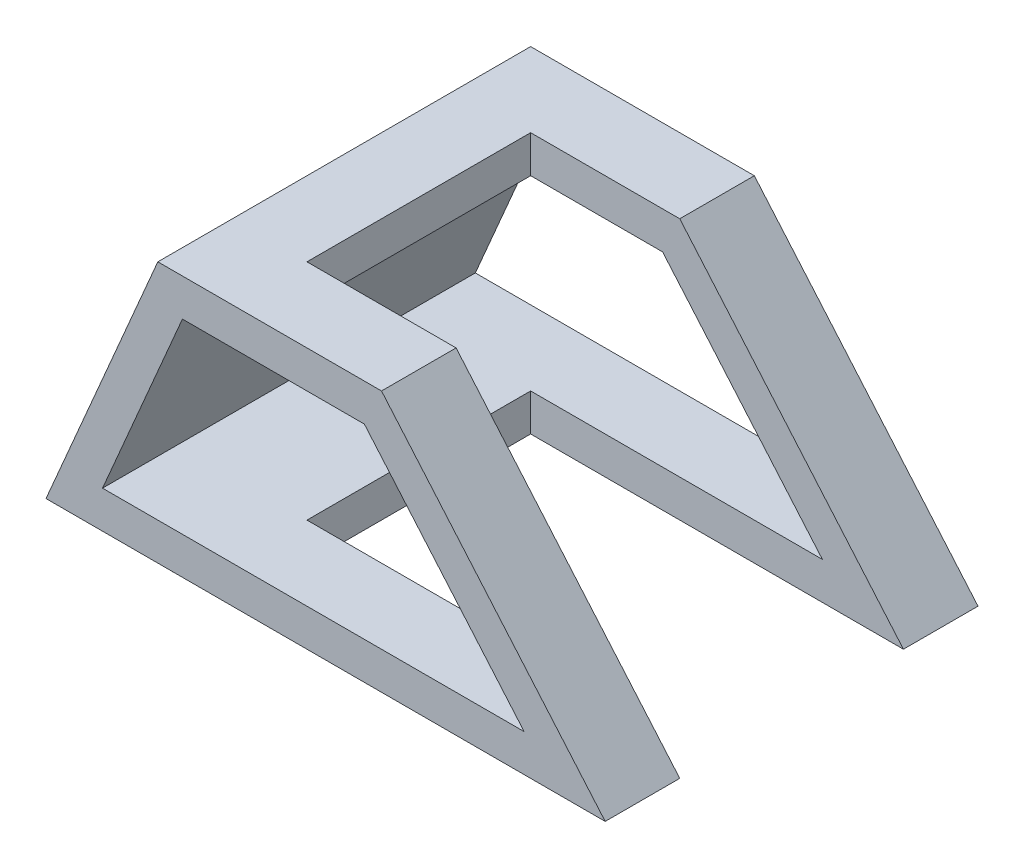
ISO-10303-21;
HEADER;
FILE_DESCRIPTION(('STEP AP214'),'2;1');
FILE_NAME('part.step','',(''),(''),'','','');
FILE_SCHEMA(('AUTOMOTIVE_DESIGN { 1 0 10303 214 1 1 1 1 }'));
ENDSEC;
DATA;
#1=APPLICATION_CONTEXT('core data for automotive mechanical design processes');
#2=APPLICATION_PROTOCOL_DEFINITION('international standard','automotive_design',2000,#1);
#3=PRODUCT_CONTEXT('',#1,'mechanical');
#4=PRODUCT('Part','Part','',(#3));
#5=PRODUCT_RELATED_PRODUCT_CATEGORY('part','',(#4));
#6=PRODUCT_DEFINITION_FORMATION('','',#4);
#7=PRODUCT_DEFINITION_CONTEXT('part definition',#1,'design');
#8=PRODUCT_DEFINITION('design','',#6,#7);
#9=PRODUCT_DEFINITION_SHAPE('','',#8);
#10=(LENGTH_UNIT() NAMED_UNIT(*) SI_UNIT(.MILLI.,.METRE.));
#11=(NAMED_UNIT(*) PLANE_ANGLE_UNIT() SI_UNIT($,.RADIAN.));
#12=(NAMED_UNIT(*) SI_UNIT($,.STERADIAN.) SOLID_ANGLE_UNIT());
#13=UNCERTAINTY_MEASURE_WITH_UNIT(LENGTH_MEASURE(1.E-05),#10,'distance_accuracy_value','');
#14=(GEOMETRIC_REPRESENTATION_CONTEXT(3) GLOBAL_UNCERTAINTY_ASSIGNED_CONTEXT((#13)) GLOBAL_UNIT_ASSIGNED_CONTEXT((#10,
#11,#12)) REPRESENTATION_CONTEXT('',''));
#15=CARTESIAN_POINT('',(0.,0.,0.));
#16=DIRECTION('',(0.,0.,1.));
#17=DIRECTION('',(1.,0.,0.));
#18=AXIS2_PLACEMENT_3D('',#15,#16,#17);
#19=CARTESIAN_POINT('',(60.,0.,100.));
#20=DIRECTION('',(-0.759256602365297,-0.650791373455968,0.));
#21=DIRECTION('',(0.650791373455968,-0.759256602365297,0.));
#22=AXIS2_PLACEMENT_3D('',#19,#20,#21);
#23=PLANE('',#22);
#24=DIRECTION('',(0.,0.,-1.));
#25=VECTOR('',#24,1.);
#26=CARTESIAN_POINT('',(120.,-70.,100.));
#27=LINE('',#26,#25);
#28=CARTESIAN_POINT('',(120.,-70.,100.));
#29=VERTEX_POINT('',#28);
#30=CARTESIAN_POINT('',(120.,-70.,80.));
#31=VERTEX_POINT('',#30);
#32=EDGE_CURVE('E185',#29,#31,#27,.T.);
#33=ORIENTED_EDGE('',*,*,#32,.T.);
#34=DIRECTION('',(0.650791373455969,-0.759256602365296,0.));
#35=VECTOR('',#34,1.);
#36=CARTESIAN_POINT('',(120.,-70.,80.));
#37=LINE('',#36,#35);
#38=CARTESIAN_POINT('',(60.,0.,80.));
#39=VERTEX_POINT('',#38);
#40=EDGE_CURVE('E170',#39,#31,#37,.T.);
#41=ORIENTED_EDGE('',*,*,#40,.F.);
#42=DIRECTION('',(0.,0.,-1.));
#43=VECTOR('',#42,1.);
#44=CARTESIAN_POINT('',(60.,0.,100.));
#45=LINE('',#44,#43);
#46=CARTESIAN_POINT('',(60.,0.,100.));
#47=VERTEX_POINT('',#46);
#48=EDGE_CURVE('E176',#47,#39,#45,.T.);
#49=ORIENTED_EDGE('',*,*,#48,.F.);
#50=DIRECTION('',(-0.650791373455968,0.759256602365297,0.));
#51=VECTOR('',#50,1.);
#52=CARTESIAN_POINT('',(60.,0.,100.));
#53=LINE('',#52,#51);
#54=EDGE_CURVE('E272',#29,#47,#53,.T.);
#55=ORIENTED_EDGE('',*,*,#54,.F.);
#56=EDGE_LOOP('',(#33,#41,#49,#55));
#57=FACE_BOUND('',#56,.T.);
#58=ADVANCED_FACE('F35',(#57),#23,.F.);
#59=CARTESIAN_POINT('',(55.4006507752959,-10.,0.));
#60=DIRECTION('',(0.759256602365297,0.650791373455969,0.));
#61=DIRECTION('',(-0.650791373455969,0.759256602365296,0.));
#62=AXIS2_PLACEMENT_3D('',#59,#60,#61);
#63=PLANE('',#62);
#64=DIRECTION('',(0.,0.,1.));
#65=VECTOR('',#64,1.);
#66=CARTESIAN_POINT('',(55.4006507752959,-10.,0.));
#67=LINE('',#66,#65);
#68=CARTESIAN_POINT('',(55.4006507752959,-10.,80.));
#69=VERTEX_POINT('',#68);
#70=CARTESIAN_POINT('',(55.4006507752959,-10.,100.));
#71=VERTEX_POINT('',#70);
#72=EDGE_CURVE('E262',#69,#71,#67,.T.);
#73=ORIENTED_EDGE('',*,*,#72,.F.);
#74=DIRECTION('',(0.650791373455969,-0.759256602365296,0.));
#75=VECTOR('',#74,1.);
#76=CARTESIAN_POINT('',(55.4006507752959,-10.,80.));
#77=LINE('',#76,#75);
#78=CARTESIAN_POINT('',(98.2577936324387,-60.,80.));
#79=VERTEX_POINT('',#78);
#80=EDGE_CURVE('E230',#69,#79,#77,.T.);
#81=ORIENTED_EDGE('',*,*,#80,.T.);
#82=DIRECTION('',(0.,0.,1.));
#83=VECTOR('',#82,1.);
#84=CARTESIAN_POINT('',(98.2577936324387,-60.,0.));
#85=LINE('',#84,#83);
#86=CARTESIAN_POINT('',(98.2577936324387,-60.,100.));
#87=VERTEX_POINT('',#86);
#88=EDGE_CURVE('E198',#79,#87,#85,.T.);
#89=ORIENTED_EDGE('',*,*,#88,.T.);
#90=DIRECTION('',(-0.650791373455969,0.759256602365297,0.));
#91=VECTOR('',#90,1.);
#92=CARTESIAN_POINT('',(55.4006507752959,-10.,100.));
#93=LINE('',#92,#91);
#94=EDGE_CURVE('E251',#87,#71,#93,.T.);
#95=ORIENTED_EDGE('',*,*,#94,.T.);
#96=EDGE_LOOP('',(#73,#81,#89,#95));
#97=FACE_BOUND('',#96,.T.);
#98=ADVANCED_FACE('F317',(#97),#63,.F.);
#99=CARTESIAN_POINT('',(-30.,-70.,100.));
#100=DIRECTION('',(0.919145030018058,-0.393919298579167,0.));
#101=DIRECTION('',(0.393919298579167,0.919145030018058,0.));
#102=AXIS2_PLACEMENT_3D('',#99,#100,#101);
#103=PLANE('',#102);
#104=DIRECTION('',(-0.393919298579167,-0.919145030018058,0.));
#105=VECTOR('',#104,1.);
#106=CARTESIAN_POINT('',(-30.,-70.,0.));
#107=LINE('',#106,#105);
#108=CARTESIAN_POINT('',(0.,0.,0.));
#109=VERTEX_POINT('',#108);
#110=CARTESIAN_POINT('',(-30.,-70.,0.));
#111=VERTEX_POINT('',#110);
#112=EDGE_CURVE('E258',#109,#111,#107,.T.);
#113=ORIENTED_EDGE('',*,*,#112,.T.);
#114=DIRECTION('',(0.,0.,-1.));
#115=VECTOR('',#114,1.);
#116=CARTESIAN_POINT('',(-30.,-70.,100.));
#117=LINE('',#116,#115);
#118=CARTESIAN_POINT('',(-30.,-70.,100.));
#119=VERTEX_POINT('',#118);
#120=EDGE_CURVE('E188',#119,#111,#117,.T.);
#121=ORIENTED_EDGE('',*,*,#120,.F.);
#122=DIRECTION('',(-0.393919298579167,-0.919145030018058,0.));
#123=VECTOR('',#122,1.);
#124=CARTESIAN_POINT('',(-30.,-70.,100.));
#125=LINE('',#124,#123);
#126=CARTESIAN_POINT('',(0.,0.,100.));
#127=VERTEX_POINT('',#126);
#128=EDGE_CURVE('E266',#127,#119,#125,.T.);
#129=ORIENTED_EDGE('',*,*,#128,.F.);
#130=DIRECTION('',(0.,0.,-1.));
#131=VECTOR('',#130,1.);
#132=CARTESIAN_POINT('',(0.,0.,100.));
#133=LINE('',#132,#131);
#134=EDGE_CURVE('E177',#127,#109,#133,.T.);
#135=ORIENTED_EDGE('',*,*,#134,.T.);
#136=EDGE_LOOP('',(#113,#121,#129,#135));
#137=FACE_BOUND('',#136,.T.);
#138=ADVANCED_FACE('F37',(#137),#103,.F.);
#139=CARTESIAN_POINT('',(120.,-70.,100.));
#140=DIRECTION('',(0.,1.,0.));
#141=DIRECTION('',(-1.,0.,0.));
#142=AXIS2_PLACEMENT_3D('',#139,#140,#141);
#143=PLANE('',#142);
#144=DIRECTION('',(0.,0.,1.));
#145=VECTOR('',#144,1.);
#146=CARTESIAN_POINT('',(20.,-70.,100.));
#147=LINE('',#146,#145);
#148=CARTESIAN_POINT('',(20.,-70.,20.));
#149=VERTEX_POINT('',#148);
#150=CARTESIAN_POINT('',(20.,-70.,80.));
#151=VERTEX_POINT('',#150);
#152=EDGE_CURVE('E216',#149,#151,#147,.T.);
#153=ORIENTED_EDGE('',*,*,#152,.T.);
#154=DIRECTION('',(1.,0.,0.));
#155=VECTOR('',#154,1.);
#156=CARTESIAN_POINT('',(120.,-70.,80.));
#157=LINE('',#156,#155);
#158=EDGE_CURVE('E211',#151,#31,#157,.T.);
#159=ORIENTED_EDGE('',*,*,#158,.T.);
#160=ORIENTED_EDGE('',*,*,#32,.F.);
#161=DIRECTION('',(1.,0.,0.));
#162=VECTOR('',#161,1.);
#163=CARTESIAN_POINT('',(120.,-70.,100.));
#164=LINE('',#163,#162);
#165=EDGE_CURVE('E269',#119,#29,#164,.T.);
#166=ORIENTED_EDGE('',*,*,#165,.F.);
#167=ORIENTED_EDGE('',*,*,#120,.T.);
#168=DIRECTION('',(1.,0.,0.));
#169=VECTOR('',#168,1.);
#170=CARTESIAN_POINT('',(120.,-70.,0.));
#171=LINE('',#170,#169);
#172=CARTESIAN_POINT('',(120.,-70.,0.));
#173=VERTEX_POINT('',#172);
#174=EDGE_CURVE('E277',#111,#173,#171,.T.);
#175=ORIENTED_EDGE('',*,*,#174,.T.);
#176=CARTESIAN_POINT('',(120.,-70.,20.));
#177=VERTEX_POINT('',#176);
#178=EDGE_CURVE('E179',#177,#173,#27,.T.);
#179=ORIENTED_EDGE('',*,*,#178,.F.);
#180=DIRECTION('',(-1.,0.,0.));
#181=VECTOR('',#180,1.);
#182=CARTESIAN_POINT('',(120.,-70.,20.));
#183=LINE('',#182,#181);
#184=EDGE_CURVE('E166',#177,#149,#183,.T.);
#185=ORIENTED_EDGE('',*,*,#184,.T.);
#186=EDGE_LOOP('',(#153,#159,#160,#166,#167,#175,#179,#185));
#187=FACE_BOUND('',#186,.T.);
#188=ADVANCED_FACE('F289',(#187),#143,.F.);
#189=CARTESIAN_POINT('',(60.,0.,20.));
#190=VERTEX_POINT('',#189);
#191=CARTESIAN_POINT('',(60.,0.,0.));
#192=VERTEX_POINT('',#191);
#193=EDGE_CURVE('E154',#190,#192,#45,.T.);
#194=ORIENTED_EDGE('',*,*,#193,.F.);
#195=DIRECTION('',(-0.650791373455969,0.759256602365296,0.));
#196=VECTOR('',#195,1.);
#197=CARTESIAN_POINT('',(60.,0.,20.));
#198=LINE('',#197,#196);
#199=EDGE_CURVE('E163',#177,#190,#198,.T.);
#200=ORIENTED_EDGE('',*,*,#199,.F.);
#201=ORIENTED_EDGE('',*,*,#178,.T.);
#202=DIRECTION('',(-0.650791373455968,0.759256602365297,0.));
#203=VECTOR('',#202,1.);
#204=CARTESIAN_POINT('',(60.,0.,0.));
#205=LINE('',#204,#203);
#206=EDGE_CURVE('E174',#173,#192,#205,.T.);
#207=ORIENTED_EDGE('',*,*,#206,.T.);
#208=EDGE_LOOP('',(#194,#200,#201,#207));
#209=FACE_BOUND('',#208,.T.);
#210=ADVANCED_FACE('F172',(#209),#23,.F.);
#211=CARTESIAN_POINT('',(0.,0.,100.));
#212=DIRECTION('',(0.,-1.,0.));
#213=DIRECTION('',(0.,0.,-1.));
#214=AXIS2_PLACEMENT_3D('',#211,#212,#213);
#215=PLANE('',#214);
#216=ORIENTED_EDGE('',*,*,#48,.T.);
#217=DIRECTION('',(1.,0.,0.));
#218=VECTOR('',#217,1.);
#219=CARTESIAN_POINT('',(60.,0.,80.));
#220=LINE('',#219,#218);
#221=CARTESIAN_POINT('',(20.,0.,80.));
#222=VERTEX_POINT('',#221);
#223=EDGE_CURVE('E220',#222,#39,#220,.T.);
#224=ORIENTED_EDGE('',*,*,#223,.F.);
#225=DIRECTION('',(0.,0.,1.));
#226=VECTOR('',#225,1.);
#227=CARTESIAN_POINT('',(20.,0.,80.));
#228=LINE('',#227,#226);
#229=CARTESIAN_POINT('',(20.,0.,20.));
#230=VERTEX_POINT('',#229);
#231=EDGE_CURVE('E158',#230,#222,#228,.T.);
#232=ORIENTED_EDGE('',*,*,#231,.F.);
#233=DIRECTION('',(-1.,0.,0.));
#234=VECTOR('',#233,1.);
#235=CARTESIAN_POINT('',(60.,0.,20.));
#236=LINE('',#235,#234);
#237=EDGE_CURVE('E149',#190,#230,#236,.T.);
#238=ORIENTED_EDGE('',*,*,#237,.F.);
#239=ORIENTED_EDGE('',*,*,#193,.T.);
#240=DIRECTION('',(-1.,0.,0.));
#241=VECTOR('',#240,1.);
#242=CARTESIAN_POINT('',(0.,0.,0.));
#243=LINE('',#242,#241);
#244=EDGE_CURVE('E270',#192,#109,#243,.T.);
#245=ORIENTED_EDGE('',*,*,#244,.T.);
#246=ORIENTED_EDGE('',*,*,#134,.F.);
#247=DIRECTION('',(-1.,0.,0.));
#248=VECTOR('',#247,1.);
#249=CARTESIAN_POINT('',(0.,0.,100.));
#250=LINE('',#249,#248);
#251=EDGE_CURVE('E181',#47,#127,#250,.T.);
#252=ORIENTED_EDGE('',*,*,#251,.F.);
#253=EDGE_LOOP('',(#216,#224,#232,#238,#239,#245,#246,#252));
#254=FACE_BOUND('',#253,.T.);
#255=ADVANCED_FACE('F152',(#254),#215,.F.);
#256=CARTESIAN_POINT('',(0.,0.,100.));
#257=DIRECTION('',(0.,0.,-1.));
#258=DIRECTION('',(-1.,0.,0.));
#259=AXIS2_PLACEMENT_3D('',#256,#257,#258);
#260=PLANE('',#259);
#261=DIRECTION('',(1.,0.,0.));
#262=VECTOR('',#261,1.);
#263=CARTESIAN_POINT('',(-14.8346098487658,-60.,100.));
#264=LINE('',#263,#262);
#265=CARTESIAN_POINT('',(-14.8346098487658,-60.,100.));
#266=VERTEX_POINT('',#265);
#267=EDGE_CURVE('E249',#266,#87,#264,.T.);
#268=ORIENTED_EDGE('',*,*,#267,.F.);
#269=DIRECTION('',(-0.393919298579167,-0.919145030018058,0.));
#270=VECTOR('',#269,1.);
#271=CARTESIAN_POINT('',(6.59396157980558,-10.,100.));
#272=LINE('',#271,#270);
#273=CARTESIAN_POINT('',(6.59396157980558,-10.,100.));
#274=VERTEX_POINT('',#273);
#275=EDGE_CURVE('E50',#274,#266,#272,.T.);
#276=ORIENTED_EDGE('',*,*,#275,.F.);
#277=DIRECTION('',(-1.,0.,0.));
#278=VECTOR('',#277,1.);
#279=CARTESIAN_POINT('',(55.4006507752959,-10.,100.));
#280=LINE('',#279,#278);
#281=EDGE_CURVE('E240',#71,#274,#280,.T.);
#282=ORIENTED_EDGE('',*,*,#281,.F.);
#283=ORIENTED_EDGE('',*,*,#94,.F.);
#284=EDGE_LOOP('',(#268,#276,#282,#283));
#285=FACE_BOUND('',#284,.T.);
#286=ORIENTED_EDGE('',*,*,#128,.T.);
#287=ORIENTED_EDGE('',*,*,#165,.T.);
#288=ORIENTED_EDGE('',*,*,#54,.T.);
#289=ORIENTED_EDGE('',*,*,#251,.T.);
#290=EDGE_LOOP('',(#286,#287,#288,#289));
#291=FACE_BOUND('',#290,.T.);
#292=ADVANCED_FACE('F293',(#285,#291),#260,.F.);
#293=CARTESIAN_POINT('',(0.,0.,0.));
#294=DIRECTION('',(0.,0.,-1.));
#295=DIRECTION('',(-1.,0.,0.));
#296=AXIS2_PLACEMENT_3D('',#293,#294,#295);
#297=PLANE('',#296);
#298=DIRECTION('',(-0.393919298579167,-0.919145030018058,0.));
#299=VECTOR('',#298,1.);
#300=CARTESIAN_POINT('',(6.59396157980558,-10.,0.));
#301=LINE('',#300,#299);
#302=CARTESIAN_POINT('',(6.59396157980558,-10.,0.));
#303=VERTEX_POINT('',#302);
#304=CARTESIAN_POINT('',(-14.8346098487658,-60.,0.));
#305=VERTEX_POINT('',#304);
#306=EDGE_CURVE('E236',#303,#305,#301,.T.);
#307=ORIENTED_EDGE('',*,*,#306,.T.);
#308=DIRECTION('',(1.,0.,0.));
#309=VECTOR('',#308,1.);
#310=CARTESIAN_POINT('',(-14.8346098487658,-60.,0.));
#311=LINE('',#310,#309);
#312=CARTESIAN_POINT('',(98.2577936324387,-60.,0.));
#313=VERTEX_POINT('',#312);
#314=EDGE_CURVE('E239',#305,#313,#311,.T.);
#315=ORIENTED_EDGE('',*,*,#314,.T.);
#316=DIRECTION('',(-0.650791373455969,0.759256602365297,0.));
#317=VECTOR('',#316,1.);
#318=CARTESIAN_POINT('',(55.4006507752959,-10.,0.));
#319=LINE('',#318,#317);
#320=CARTESIAN_POINT('',(55.4006507752959,-10.,0.));
#321=VERTEX_POINT('',#320);
#322=EDGE_CURVE('E58',#313,#321,#319,.T.);
#323=ORIENTED_EDGE('',*,*,#322,.T.);
#324=DIRECTION('',(-1.,0.,0.));
#325=VECTOR('',#324,1.);
#326=CARTESIAN_POINT('',(55.4006507752959,-10.,0.));
#327=LINE('',#326,#325);
#328=EDGE_CURVE('E244',#321,#303,#327,.T.);
#329=ORIENTED_EDGE('',*,*,#328,.T.);
#330=EDGE_LOOP('',(#307,#315,#323,#329));
#331=FACE_BOUND('',#330,.T.);
#332=ORIENTED_EDGE('',*,*,#112,.F.);
#333=ORIENTED_EDGE('',*,*,#244,.F.);
#334=ORIENTED_EDGE('',*,*,#206,.F.);
#335=ORIENTED_EDGE('',*,*,#174,.F.);
#336=EDGE_LOOP('',(#332,#333,#334,#335));
#337=FACE_BOUND('',#336,.T.);
#338=ADVANCED_FACE('F287',(#331,#337),#297,.T.);
#339=CARTESIAN_POINT('',(6.59396157980558,-10.,0.));
#340=DIRECTION('',(-0.919145030018058,0.393919298579167,0.));
#341=DIRECTION('',(-0.393919298579167,-0.919145030018058,0.));
#342=AXIS2_PLACEMENT_3D('',#339,#340,#341);
#343=PLANE('',#342);
#344=ORIENTED_EDGE('',*,*,#275,.T.);
#345=DIRECTION('',(0.,0.,1.));
#346=VECTOR('',#345,1.);
#347=CARTESIAN_POINT('',(-14.8346098487658,-60.,0.));
#348=LINE('',#347,#346);
#349=EDGE_CURVE('E247',#305,#266,#348,.T.);
#350=ORIENTED_EDGE('',*,*,#349,.F.);
#351=ORIENTED_EDGE('',*,*,#306,.F.);
#352=DIRECTION('',(0.,0.,1.));
#353=VECTOR('',#352,1.);
#354=CARTESIAN_POINT('',(6.59396157980558,-10.,0.));
#355=LINE('',#354,#353);
#356=EDGE_CURVE('E256',#303,#274,#355,.T.);
#357=ORIENTED_EDGE('',*,*,#356,.T.);
#358=EDGE_LOOP('',(#344,#350,#351,#357));
#359=FACE_BOUND('',#358,.T.);
#360=ADVANCED_FACE('F310',(#359),#343,.F.);
#361=CARTESIAN_POINT('',(55.4006507752959,-10.,0.));
#362=DIRECTION('',(0.,1.,0.));
#363=DIRECTION('',(-1.,0.,0.));
#364=AXIS2_PLACEMENT_3D('',#361,#362,#363);
#365=PLANE('',#364);
#366=DIRECTION('',(0.,0.,1.));
#367=VECTOR('',#366,1.);
#368=CARTESIAN_POINT('',(20.,-10.,0.));
#369=LINE('',#368,#367);
#370=CARTESIAN_POINT('',(20.,-10.,20.));
#371=VERTEX_POINT('',#370);
#372=CARTESIAN_POINT('',(20.,-10.,80.));
#373=VERTEX_POINT('',#372);
#374=EDGE_CURVE('E212',#371,#373,#369,.T.);
#375=ORIENTED_EDGE('',*,*,#374,.T.);
#376=DIRECTION('',(1.,0.,0.));
#377=VECTOR('',#376,1.);
#378=CARTESIAN_POINT('',(55.4006507752959,-10.,80.));
#379=LINE('',#378,#377);
#380=EDGE_CURVE('E232',#373,#69,#379,.T.);
#381=ORIENTED_EDGE('',*,*,#380,.T.);
#382=ORIENTED_EDGE('',*,*,#72,.T.);
#383=ORIENTED_EDGE('',*,*,#281,.T.);
#384=ORIENTED_EDGE('',*,*,#356,.F.);
#385=ORIENTED_EDGE('',*,*,#328,.F.);
#386=CARTESIAN_POINT('',(55.4006507752959,-10.,20.));
#387=VERTEX_POINT('',#386);
#388=EDGE_CURVE('E259',#321,#387,#67,.T.);
#389=ORIENTED_EDGE('',*,*,#388,.T.);
#390=DIRECTION('',(-1.,0.,0.));
#391=VECTOR('',#390,1.);
#392=CARTESIAN_POINT('',(55.4006507752959,-10.,20.));
#393=LINE('',#392,#391);
#394=EDGE_CURVE('E227',#387,#371,#393,.T.);
#395=ORIENTED_EDGE('',*,*,#394,.T.);
#396=EDGE_LOOP('',(#375,#381,#382,#383,#384,#385,#389,#395));
#397=FACE_BOUND('',#396,.T.);
#398=ADVANCED_FACE('F305',(#397),#365,.F.);
#399=CARTESIAN_POINT('',(98.2577936324387,-60.,20.));
#400=VERTEX_POINT('',#399);
#401=EDGE_CURVE('E263',#313,#400,#85,.T.);
#402=ORIENTED_EDGE('',*,*,#401,.T.);
#403=DIRECTION('',(-0.650791373455969,0.759256602365296,0.));
#404=VECTOR('',#403,1.);
#405=CARTESIAN_POINT('',(55.4006507752959,-10.,20.));
#406=LINE('',#405,#404);
#407=EDGE_CURVE('E169',#400,#387,#406,.T.);
#408=ORIENTED_EDGE('',*,*,#407,.T.);
#409=ORIENTED_EDGE('',*,*,#388,.F.);
#410=ORIENTED_EDGE('',*,*,#322,.F.);
#411=EDGE_LOOP('',(#402,#408,#409,#410));
#412=FACE_BOUND('',#411,.T.);
#413=ADVANCED_FACE('F306',(#412),#63,.F.);
#414=CARTESIAN_POINT('',(-14.8346098487658,-60.,0.));
#415=DIRECTION('',(0.,-1.,0.));
#416=DIRECTION('',(1.,0.,0.));
#417=AXIS2_PLACEMENT_3D('',#414,#415,#416);
#418=PLANE('',#417);
#419=DIRECTION('',(-1.,0.,0.));
#420=VECTOR('',#419,1.);
#421=CARTESIAN_POINT('',(-14.8346098487658,-60.,80.));
#422=LINE('',#421,#420);
#423=CARTESIAN_POINT('',(20.,-60.,80.));
#424=VERTEX_POINT('',#423);
#425=EDGE_CURVE('E43',#79,#424,#422,.T.);
#426=ORIENTED_EDGE('',*,*,#425,.T.);
#427=DIRECTION('',(0.,0.,-1.));
#428=VECTOR('',#427,1.);
#429=CARTESIAN_POINT('',(20.,-60.,0.));
#430=LINE('',#429,#428);
#431=CARTESIAN_POINT('',(20.,-60.,20.));
#432=VERTEX_POINT('',#431);
#433=EDGE_CURVE('E11',#424,#432,#430,.T.);
#434=ORIENTED_EDGE('',*,*,#433,.T.);
#435=DIRECTION('',(1.,0.,0.));
#436=VECTOR('',#435,1.);
#437=CARTESIAN_POINT('',(-14.8346098487658,-60.,20.));
#438=LINE('',#437,#436);
#439=EDGE_CURVE('E191',#432,#400,#438,.T.);
#440=ORIENTED_EDGE('',*,*,#439,.T.);
#441=ORIENTED_EDGE('',*,*,#401,.F.);
#442=ORIENTED_EDGE('',*,*,#314,.F.);
#443=ORIENTED_EDGE('',*,*,#349,.T.);
#444=ORIENTED_EDGE('',*,*,#267,.T.);
#445=ORIENTED_EDGE('',*,*,#88,.F.);
#446=EDGE_LOOP('',(#426,#434,#440,#441,#442,#443,#444,#445));
#447=FACE_BOUND('',#446,.T.);
#448=ADVANCED_FACE('F196',(#447),#418,.F.);
#449=CARTESIAN_POINT('',(74.4446038580822,-109.047482407358,80.));
#450=DIRECTION('',(0.,0.,1.));
#451=DIRECTION('',(1.,0.,0.));
#452=AXIS2_PLACEMENT_3D('',#449,#450,#451);
#453=PLANE('',#452);
#454=ORIENTED_EDGE('',*,*,#40,.T.);
#455=ORIENTED_EDGE('',*,*,#158,.F.);
#456=DIRECTION('',(0.,1.,0.));
#457=VECTOR('',#456,1.);
#458=CARTESIAN_POINT('',(20.,-120.,80.));
#459=LINE('',#458,#457);
#460=EDGE_CURVE('E206',#151,#424,#459,.T.);
#461=ORIENTED_EDGE('',*,*,#460,.T.);
#462=ORIENTED_EDGE('',*,*,#425,.F.);
#463=ORIENTED_EDGE('',*,*,#80,.F.);
#464=ORIENTED_EDGE('',*,*,#380,.F.);
#465=EDGE_CURVE('E213',#373,#222,#459,.T.);
#466=ORIENTED_EDGE('',*,*,#465,.T.);
#467=ORIENTED_EDGE('',*,*,#223,.T.);
#468=EDGE_LOOP('',(#454,#455,#461,#462,#463,#464,#466,#467));
#469=FACE_BOUND('',#468,.T.);
#470=ADVANCED_FACE('F210',(#469),#453,.F.);
#471=CARTESIAN_POINT('',(14.4446038580822,-39.0474824073581,20.));
#472=DIRECTION('',(0.,0.,-1.));
#473=DIRECTION('',(0.,1.,0.));
#474=AXIS2_PLACEMENT_3D('',#471,#472,#473);
#475=PLANE('',#474);
#476=ORIENTED_EDGE('',*,*,#199,.T.);
#477=ORIENTED_EDGE('',*,*,#237,.T.);
#478=DIRECTION('',(0.,1.,0.));
#479=VECTOR('',#478,1.);
#480=CARTESIAN_POINT('',(20.,-120.,20.));
#481=LINE('',#480,#479);
#482=EDGE_CURVE('E222',#371,#230,#481,.T.);
#483=ORIENTED_EDGE('',*,*,#482,.F.);
#484=ORIENTED_EDGE('',*,*,#394,.F.);
#485=ORIENTED_EDGE('',*,*,#407,.F.);
#486=ORIENTED_EDGE('',*,*,#439,.F.);
#487=EDGE_CURVE('E208',#149,#432,#481,.T.);
#488=ORIENTED_EDGE('',*,*,#487,.F.);
#489=ORIENTED_EDGE('',*,*,#184,.F.);
#490=EDGE_LOOP('',(#476,#477,#483,#484,#485,#486,#488,#489));
#491=FACE_BOUND('',#490,.T.);
#492=ADVANCED_FACE('F164',(#491),#475,.F.);
#493=CARTESIAN_POINT('',(20.,-120.,80.));
#494=DIRECTION('',(-1.,0.,0.));
#495=DIRECTION('',(0.,0.,1.));
#496=AXIS2_PLACEMENT_3D('',#493,#494,#495);
#497=PLANE('',#496);
#498=ORIENTED_EDGE('',*,*,#487,.T.);
#499=ORIENTED_EDGE('',*,*,#433,.F.);
#500=ORIENTED_EDGE('',*,*,#460,.F.);
#501=ORIENTED_EDGE('',*,*,#152,.F.);
#502=EDGE_LOOP('',(#498,#499,#500,#501));
#503=FACE_BOUND('',#502,.T.);
#504=ADVANCED_FACE('F204',(#503),#497,.F.);
#505=ORIENTED_EDGE('',*,*,#482,.T.);
#506=ORIENTED_EDGE('',*,*,#231,.T.);
#507=ORIENTED_EDGE('',*,*,#465,.F.);
#508=ORIENTED_EDGE('',*,*,#374,.F.);
#509=EDGE_LOOP('',(#505,#506,#507,#508));
#510=FACE_BOUND('',#509,.T.);
#511=ADVANCED_FACE('F299',(#510),#497,.F.);
#512=CLOSED_SHELL('',(#58,#98,#138,#188,#210,#255,#292,#338,#360,#398,#413,#448,#470,#492,#504,#511));
#513=MANIFOLD_SOLID_BREP('B2',#512);
#514=ADVANCED_BREP_SHAPE_REPRESENTATION('',(#18,#513),#14);
#515=SHAPE_DEFINITION_REPRESENTATION(#9,#514);
ENDSEC;
END-ISO-10303-21;
